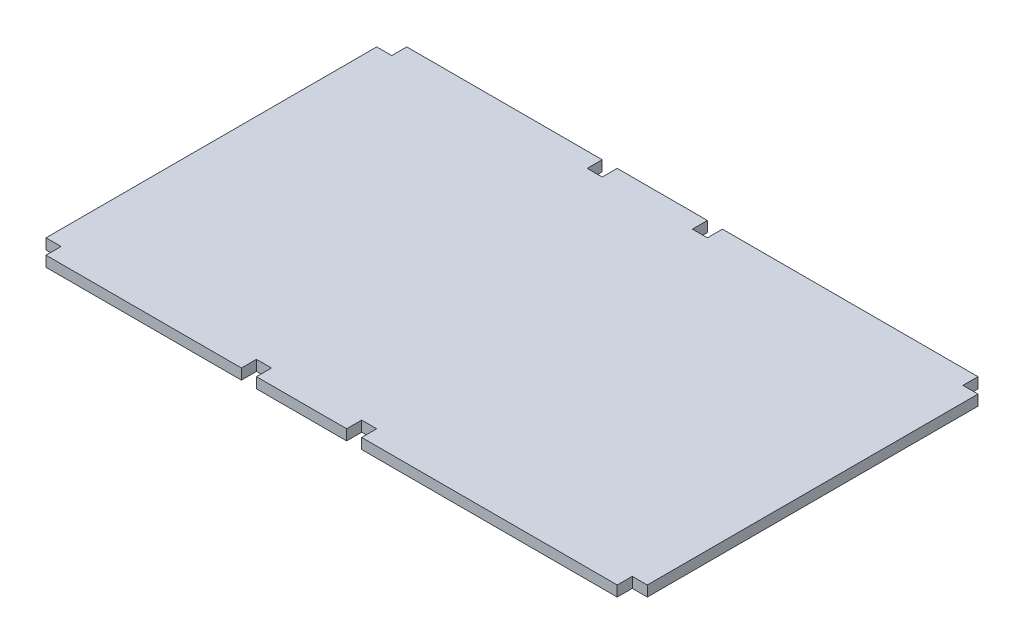
ISO-10303-21;
HEADER;
FILE_DESCRIPTION(('STEP AP214'),'2;1');
FILE_NAME('part.step','',(''),(''),'','','');
FILE_SCHEMA(('AUTOMOTIVE_DESIGN { 1 0 10303 214 1 1 1 1 }'));
ENDSEC;
DATA;
#1=APPLICATION_CONTEXT('core data for automotive mechanical design processes');
#2=APPLICATION_PROTOCOL_DEFINITION('international standard','automotive_design',2000,#1);
#3=PRODUCT_CONTEXT('',#1,'mechanical');
#4=PRODUCT('Part','Part','',(#3));
#5=PRODUCT_RELATED_PRODUCT_CATEGORY('part','',(#4));
#6=PRODUCT_DEFINITION_FORMATION('','',#4);
#7=PRODUCT_DEFINITION_CONTEXT('part definition',#1,'design');
#8=PRODUCT_DEFINITION('design','',#6,#7);
#9=PRODUCT_DEFINITION_SHAPE('','',#8);
#10=(LENGTH_UNIT() NAMED_UNIT(*) SI_UNIT(.MILLI.,.METRE.));
#11=(NAMED_UNIT(*) PLANE_ANGLE_UNIT() SI_UNIT($,.RADIAN.));
#12=(NAMED_UNIT(*) SI_UNIT($,.STERADIAN.) SOLID_ANGLE_UNIT());
#13=UNCERTAINTY_MEASURE_WITH_UNIT(LENGTH_MEASURE(1.E-05),#10,'distance_accuracy_value','');
#14=(GEOMETRIC_REPRESENTATION_CONTEXT(3) GLOBAL_UNCERTAINTY_ASSIGNED_CONTEXT((#13)) GLOBAL_UNIT_ASSIGNED_CONTEXT((#10,
#11,#12)) REPRESENTATION_CONTEXT('',''));
#15=CARTESIAN_POINT('',(0.,0.,0.));
#16=DIRECTION('',(0.,0.,1.));
#17=DIRECTION('',(1.,0.,0.));
#18=AXIS2_PLACEMENT_3D('',#15,#16,#17);
#19=CARTESIAN_POINT('',(-660.4,17.78,-584.2));
#20=DIRECTION('',(-1.,0.,0.));
#21=DIRECTION('',(0.,0.,1.));
#22=AXIS2_PLACEMENT_3D('',#19,#20,#21);
#23=PLANE('',#22);
#24=DIRECTION('',(0.,0.,-1.));
#25=VECTOR('',#24,1.);
#26=CARTESIAN_POINT('',(-660.4,0.,-584.2));
#27=LINE('',#26,#25);
#28=CARTESIAN_POINT('',(-660.4,0.,-584.2));
#29=VERTEX_POINT('',#28);
#30=CARTESIAN_POINT('',(-660.4,0.,-609.6));
#31=VERTEX_POINT('',#30);
#32=EDGE_CURVE('E253',#29,#31,#27,.T.);
#33=ORIENTED_EDGE('',*,*,#32,.T.);
#34=DIRECTION('',(0.,-1.,0.));
#35=VECTOR('',#34,1.);
#36=CARTESIAN_POINT('',(-660.4,17.78,-609.6));
#37=LINE('',#36,#35);
#38=CARTESIAN_POINT('',(-660.4,17.78,-609.6));
#39=VERTEX_POINT('',#38);
#40=EDGE_CURVE('E11',#39,#31,#37,.T.);
#41=ORIENTED_EDGE('',*,*,#40,.F.);
#42=DIRECTION('',(0.,0.,-1.));
#43=VECTOR('',#42,1.);
#44=CARTESIAN_POINT('',(-660.4,17.78,-584.2));
#45=LINE('',#44,#43);
#46=CARTESIAN_POINT('',(-660.4,17.78,-584.2));
#47=VERTEX_POINT('',#46);
#48=EDGE_CURVE('E307',#47,#39,#45,.T.);
#49=ORIENTED_EDGE('',*,*,#48,.F.);
#50=DIRECTION('',(0.,-1.,0.));
#51=VECTOR('',#50,1.);
#52=CARTESIAN_POINT('',(-660.4,17.78,-584.2));
#53=LINE('',#52,#51);
#54=EDGE_CURVE('E249',#47,#29,#53,.T.);
#55=ORIENTED_EDGE('',*,*,#54,.T.);
#56=EDGE_LOOP('',(#33,#41,#49,#55));
#57=FACE_BOUND('',#56,.T.);
#58=ADVANCED_FACE('F37',(#57),#23,.F.);
#59=CARTESIAN_POINT('',(-660.4,17.78,-609.6));
#60=DIRECTION('',(0.,0.,1.));
#61=DIRECTION('',(1.,0.,0.));
#62=AXIS2_PLACEMENT_3D('',#59,#60,#61);
#63=PLANE('',#62);
#64=DIRECTION('',(-1.,0.,0.));
#65=VECTOR('',#64,1.);
#66=CARTESIAN_POINT('',(-660.4,0.,-609.6));
#67=LINE('',#66,#65);
#68=CARTESIAN_POINT('',(-990.6,0.,-609.6));
#69=VERTEX_POINT('',#68);
#70=EDGE_CURVE('E256',#31,#69,#67,.T.);
#71=ORIENTED_EDGE('',*,*,#70,.T.);
#72=DIRECTION('',(0.,-1.,0.));
#73=VECTOR('',#72,1.);
#74=CARTESIAN_POINT('',(-990.6,17.78,-609.6));
#75=LINE('',#74,#73);
#76=CARTESIAN_POINT('',(-990.6,17.78,-609.6));
#77=VERTEX_POINT('',#76);
#78=EDGE_CURVE('E45',#77,#69,#75,.T.);
#79=ORIENTED_EDGE('',*,*,#78,.F.);
#80=DIRECTION('',(-1.,0.,0.));
#81=VECTOR('',#80,1.);
#82=CARTESIAN_POINT('',(-660.4,17.78,-609.6));
#83=LINE('',#82,#81);
#84=EDGE_CURVE('E156',#39,#77,#83,.T.);
#85=ORIENTED_EDGE('',*,*,#84,.F.);
#86=ORIENTED_EDGE('',*,*,#40,.T.);
#87=EDGE_LOOP('',(#71,#79,#85,#86));
#88=FACE_BOUND('',#87,.T.);
#89=ADVANCED_FACE('F465',(#88),#63,.F.);
#90=CARTESIAN_POINT('',(-990.6,17.78,-609.6));
#91=DIRECTION('',(1.,0.,0.));
#92=DIRECTION('',(0.,0.,-1.));
#93=AXIS2_PLACEMENT_3D('',#90,#91,#92);
#94=PLANE('',#93);
#95=DIRECTION('',(0.,0.,1.));
#96=VECTOR('',#95,1.);
#97=CARTESIAN_POINT('',(-990.6,0.,-609.6));
#98=LINE('',#97,#96);
#99=CARTESIAN_POINT('',(-990.6,0.,-584.2));
#100=VERTEX_POINT('',#99);
#101=EDGE_CURVE('E258',#69,#100,#98,.T.);
#102=ORIENTED_EDGE('',*,*,#101,.T.);
#103=DIRECTION('',(0.,-1.,0.));
#104=VECTOR('',#103,1.);
#105=CARTESIAN_POINT('',(-990.6,17.78,-584.2));
#106=LINE('',#105,#104);
#107=CARTESIAN_POINT('',(-990.6,17.78,-584.2));
#108=VERTEX_POINT('',#107);
#109=EDGE_CURVE('E374',#108,#100,#106,.T.);
#110=ORIENTED_EDGE('',*,*,#109,.F.);
#111=DIRECTION('',(0.,0.,1.));
#112=VECTOR('',#111,1.);
#113=CARTESIAN_POINT('',(-990.6,17.78,-609.6));
#114=LINE('',#113,#112);
#115=EDGE_CURVE('E382',#77,#108,#114,.T.);
#116=ORIENTED_EDGE('',*,*,#115,.F.);
#117=ORIENTED_EDGE('',*,*,#78,.T.);
#118=EDGE_LOOP('',(#102,#110,#116,#117));
#119=FACE_BOUND('',#118,.T.);
#120=ADVANCED_FACE('F380',(#119),#94,.F.);
#121=CARTESIAN_POINT('',(-1016.,17.78,-584.2));
#122=DIRECTION('',(0.,0.,1.));
#123=DIRECTION('',(1.,0.,0.));
#124=AXIS2_PLACEMENT_3D('',#121,#122,#123);
#125=PLANE('',#124);
#126=DIRECTION('',(-1.,0.,0.));
#127=VECTOR('',#126,1.);
#128=CARTESIAN_POINT('',(-1016.,0.,-584.2));
#129=LINE('',#128,#127);
#130=CARTESIAN_POINT('',(-1016.,0.,-584.2));
#131=VERTEX_POINT('',#130);
#132=EDGE_CURVE('E260',#100,#131,#129,.T.);
#133=ORIENTED_EDGE('',*,*,#132,.T.);
#134=DIRECTION('',(0.,-1.,0.));
#135=VECTOR('',#134,1.);
#136=CARTESIAN_POINT('',(-1016.,17.78,-584.2));
#137=LINE('',#136,#135);
#138=CARTESIAN_POINT('',(-1016.,17.78,-584.2));
#139=VERTEX_POINT('',#138);
#140=EDGE_CURVE('E371',#139,#131,#137,.T.);
#141=ORIENTED_EDGE('',*,*,#140,.F.);
#142=DIRECTION('',(-1.,0.,0.));
#143=VECTOR('',#142,1.);
#144=CARTESIAN_POINT('',(-1016.,17.78,-584.2));
#145=LINE('',#144,#143);
#146=EDGE_CURVE('E400',#108,#139,#145,.T.);
#147=ORIENTED_EDGE('',*,*,#146,.F.);
#148=ORIENTED_EDGE('',*,*,#109,.T.);
#149=EDGE_LOOP('',(#133,#141,#147,#148));
#150=FACE_BOUND('',#149,.T.);
#151=ADVANCED_FACE('F391',(#150),#125,.F.);
#152=CARTESIAN_POINT('',(-1016.,17.78,-25.3999999999999));
#153=DIRECTION('',(1.,0.,0.));
#154=DIRECTION('',(0.,0.,-1.));
#155=AXIS2_PLACEMENT_3D('',#152,#153,#154);
#156=PLANE('',#155);
#157=DIRECTION('',(0.,0.,1.));
#158=VECTOR('',#157,1.);
#159=CARTESIAN_POINT('',(-1016.,0.,-25.3999999999999));
#160=LINE('',#159,#158);
#161=CARTESIAN_POINT('',(-1016.,0.,-25.3999999999999));
#162=VERTEX_POINT('',#161);
#163=EDGE_CURVE('E262',#131,#162,#160,.T.);
#164=ORIENTED_EDGE('',*,*,#163,.T.);
#165=DIRECTION('',(0.,-1.,0.));
#166=VECTOR('',#165,1.);
#167=CARTESIAN_POINT('',(-1016.,17.78,-25.3999999999999));
#168=LINE('',#167,#166);
#169=CARTESIAN_POINT('',(-1016.,17.78,-25.3999999999999));
#170=VERTEX_POINT('',#169);
#171=EDGE_CURVE('E368',#170,#162,#168,.T.);
#172=ORIENTED_EDGE('',*,*,#171,.F.);
#173=DIRECTION('',(0.,0.,1.));
#174=VECTOR('',#173,1.);
#175=CARTESIAN_POINT('',(-1016.,17.78,-25.3999999999999));
#176=LINE('',#175,#174);
#177=EDGE_CURVE('E397',#139,#170,#176,.T.);
#178=ORIENTED_EDGE('',*,*,#177,.F.);
#179=ORIENTED_EDGE('',*,*,#140,.T.);
#180=EDGE_LOOP('',(#164,#172,#178,#179));
#181=FACE_BOUND('',#180,.T.);
#182=ADVANCED_FACE('F395',(#181),#156,.F.);
#183=CARTESIAN_POINT('',(-1016.,17.78,-25.3999999999999));
#184=DIRECTION('',(0.,0.,-1.));
#185=DIRECTION('',(-1.,0.,0.));
#186=AXIS2_PLACEMENT_3D('',#183,#184,#185);
#187=PLANE('',#186);
#188=DIRECTION('',(1.,0.,0.));
#189=VECTOR('',#188,1.);
#190=CARTESIAN_POINT('',(-1016.,0.,-25.3999999999999));
#191=LINE('',#190,#189);
#192=CARTESIAN_POINT('',(-990.6,0.,-25.3999999999999));
#193=VERTEX_POINT('',#192);
#194=EDGE_CURVE('E264',#162,#193,#191,.T.);
#195=ORIENTED_EDGE('',*,*,#194,.T.);
#196=DIRECTION('',(0.,-1.,0.));
#197=VECTOR('',#196,1.);
#198=CARTESIAN_POINT('',(-990.6,17.78,-25.3999999999999));
#199=LINE('',#198,#197);
#200=CARTESIAN_POINT('',(-990.6,17.78,-25.3999999999999));
#201=VERTEX_POINT('',#200);
#202=EDGE_CURVE('E365',#201,#193,#199,.T.);
#203=ORIENTED_EDGE('',*,*,#202,.F.);
#204=DIRECTION('',(1.,0.,0.));
#205=VECTOR('',#204,1.);
#206=CARTESIAN_POINT('',(-1016.,17.78,-25.3999999999999));
#207=LINE('',#206,#205);
#208=EDGE_CURVE('E399',#170,#201,#207,.T.);
#209=ORIENTED_EDGE('',*,*,#208,.F.);
#210=ORIENTED_EDGE('',*,*,#171,.T.);
#211=EDGE_LOOP('',(#195,#203,#209,#210));
#212=FACE_BOUND('',#211,.T.);
#213=ADVANCED_FACE('F478',(#212),#187,.F.);
#214=CARTESIAN_POINT('',(-990.6,17.78,1.24424114793371E-13));
#215=DIRECTION('',(1.,0.,0.));
#216=DIRECTION('',(0.,0.,-1.));
#217=AXIS2_PLACEMENT_3D('',#214,#215,#216);
#218=PLANE('',#217);
#219=DIRECTION('',(0.,0.,1.));
#220=VECTOR('',#219,1.);
#221=CARTESIAN_POINT('',(-990.6,0.,1.24424114793371E-13));
#222=LINE('',#221,#220);
#223=CARTESIAN_POINT('',(-990.6,0.,1.24424114793371E-13));
#224=VERTEX_POINT('',#223);
#225=EDGE_CURVE('E266',#193,#224,#222,.T.);
#226=ORIENTED_EDGE('',*,*,#225,.T.);
#227=DIRECTION('',(0.,-1.,0.));
#228=VECTOR('',#227,1.);
#229=CARTESIAN_POINT('',(-990.6,17.78,1.24424114793371E-13));
#230=LINE('',#229,#228);
#231=CARTESIAN_POINT('',(-990.6,17.78,1.24424114793371E-13));
#232=VERTEX_POINT('',#231);
#233=EDGE_CURVE('E362',#232,#224,#230,.T.);
#234=ORIENTED_EDGE('',*,*,#233,.F.);
#235=DIRECTION('',(0.,0.,1.));
#236=VECTOR('',#235,1.);
#237=CARTESIAN_POINT('',(-990.6,17.78,1.24424114793371E-13));
#238=LINE('',#237,#236);
#239=EDGE_CURVE('E402',#201,#232,#238,.T.);
#240=ORIENTED_EDGE('',*,*,#239,.F.);
#241=ORIENTED_EDGE('',*,*,#202,.T.);
#242=EDGE_LOOP('',(#226,#234,#240,#241));
#243=FACE_BOUND('',#242,.T.);
#244=ADVANCED_FACE('F481',(#243),#218,.F.);
#245=CARTESIAN_POINT('',(-660.4,17.78,0.));
#246=DIRECTION('',(0.,0.,-1.));
#247=DIRECTION('',(-1.,0.,0.));
#248=AXIS2_PLACEMENT_3D('',#245,#246,#247);
#249=PLANE('',#248);
#250=DIRECTION('',(1.,0.,0.));
#251=VECTOR('',#250,1.);
#252=CARTESIAN_POINT('',(-660.4,0.,0.));
#253=LINE('',#252,#251);
#254=CARTESIAN_POINT('',(-660.4,0.,0.));
#255=VERTEX_POINT('',#254);
#256=EDGE_CURVE('E268',#224,#255,#253,.T.);
#257=ORIENTED_EDGE('',*,*,#256,.T.);
#258=DIRECTION('',(0.,-1.,0.));
#259=VECTOR('',#258,1.);
#260=CARTESIAN_POINT('',(-660.4,17.78,0.));
#261=LINE('',#260,#259);
#262=CARTESIAN_POINT('',(-660.4,17.78,0.));
#263=VERTEX_POINT('',#262);
#264=EDGE_CURVE('E359',#263,#255,#261,.T.);
#265=ORIENTED_EDGE('',*,*,#264,.F.);
#266=DIRECTION('',(1.,0.,0.));
#267=VECTOR('',#266,1.);
#268=CARTESIAN_POINT('',(-660.4,17.78,0.));
#269=LINE('',#268,#267);
#270=EDGE_CURVE('E408',#232,#263,#269,.T.);
#271=ORIENTED_EDGE('',*,*,#270,.F.);
#272=ORIENTED_EDGE('',*,*,#233,.T.);
#273=EDGE_LOOP('',(#257,#265,#271,#272));
#274=FACE_BOUND('',#273,.T.);
#275=ADVANCED_FACE('F485',(#274),#249,.F.);
#276=CARTESIAN_POINT('',(-660.4,17.78,0.));
#277=DIRECTION('',(-1.,0.,0.));
#278=DIRECTION('',(0.,0.,1.));
#279=AXIS2_PLACEMENT_3D('',#276,#277,#278);
#280=PLANE('',#279);
#281=DIRECTION('',(0.,0.,-1.));
#282=VECTOR('',#281,1.);
#283=CARTESIAN_POINT('',(-660.4,0.,0.));
#284=LINE('',#283,#282);
#285=CARTESIAN_POINT('',(-660.4,0.,-25.4));
#286=VERTEX_POINT('',#285);
#287=EDGE_CURVE('E270',#255,#286,#284,.T.);
#288=ORIENTED_EDGE('',*,*,#287,.T.);
#289=DIRECTION('',(0.,-1.,0.));
#290=VECTOR('',#289,1.);
#291=CARTESIAN_POINT('',(-660.4,17.78,-25.4));
#292=LINE('',#291,#290);
#293=CARTESIAN_POINT('',(-660.4,17.78,-25.4));
#294=VERTEX_POINT('',#293);
#295=EDGE_CURVE('E356',#294,#286,#292,.T.);
#296=ORIENTED_EDGE('',*,*,#295,.F.);
#297=DIRECTION('',(0.,0.,-1.));
#298=VECTOR('',#297,1.);
#299=CARTESIAN_POINT('',(-660.4,17.78,0.));
#300=LINE('',#299,#298);
#301=EDGE_CURVE('E410',#263,#294,#300,.T.);
#302=ORIENTED_EDGE('',*,*,#301,.F.);
#303=ORIENTED_EDGE('',*,*,#264,.T.);
#304=EDGE_LOOP('',(#288,#296,#302,#303));
#305=FACE_BOUND('',#304,.T.);
#306=ADVANCED_FACE('F489',(#305),#280,.F.);
#307=CARTESIAN_POINT('',(-635.,17.78,-25.4));
#308=DIRECTION('',(0.,0.,-1.));
#309=DIRECTION('',(-1.,0.,0.));
#310=AXIS2_PLACEMENT_3D('',#307,#308,#309);
#311=PLANE('',#310);
#312=DIRECTION('',(1.,0.,0.));
#313=VECTOR('',#312,1.);
#314=CARTESIAN_POINT('',(-635.,0.,-25.4));
#315=LINE('',#314,#313);
#316=CARTESIAN_POINT('',(-635.,0.,-25.4));
#317=VERTEX_POINT('',#316);
#318=EDGE_CURVE('E272',#286,#317,#315,.T.);
#319=ORIENTED_EDGE('',*,*,#318,.T.);
#320=DIRECTION('',(0.,-1.,0.));
#321=VECTOR('',#320,1.);
#322=CARTESIAN_POINT('',(-635.,17.78,-25.4));
#323=LINE('',#322,#321);
#324=CARTESIAN_POINT('',(-635.,17.78,-25.4));
#325=VERTEX_POINT('',#324);
#326=EDGE_CURVE('E353',#325,#317,#323,.T.);
#327=ORIENTED_EDGE('',*,*,#326,.F.);
#328=DIRECTION('',(1.,0.,0.));
#329=VECTOR('',#328,1.);
#330=CARTESIAN_POINT('',(-635.,17.78,-25.4));
#331=LINE('',#330,#329);
#332=EDGE_CURVE('E412',#294,#325,#331,.T.);
#333=ORIENTED_EDGE('',*,*,#332,.F.);
#334=ORIENTED_EDGE('',*,*,#295,.T.);
#335=EDGE_LOOP('',(#319,#327,#333,#334));
#336=FACE_BOUND('',#335,.T.);
#337=ADVANCED_FACE('F493',(#336),#311,.F.);
#338=CARTESIAN_POINT('',(-635.,17.78,0.));
#339=DIRECTION('',(1.,0.,0.));
#340=DIRECTION('',(0.,0.,-1.));
#341=AXIS2_PLACEMENT_3D('',#338,#339,#340);
#342=PLANE('',#341);
#343=DIRECTION('',(0.,0.,1.));
#344=VECTOR('',#343,1.);
#345=CARTESIAN_POINT('',(-635.,0.,0.));
#346=LINE('',#345,#344);
#347=CARTESIAN_POINT('',(-635.,0.,0.));
#348=VERTEX_POINT('',#347);
#349=EDGE_CURVE('E274',#317,#348,#346,.T.);
#350=ORIENTED_EDGE('',*,*,#349,.T.);
#351=DIRECTION('',(0.,-1.,0.));
#352=VECTOR('',#351,1.);
#353=CARTESIAN_POINT('',(-635.,17.78,0.));
#354=LINE('',#353,#352);
#355=CARTESIAN_POINT('',(-635.,17.78,0.));
#356=VERTEX_POINT('',#355);
#357=EDGE_CURVE('E350',#356,#348,#354,.T.);
#358=ORIENTED_EDGE('',*,*,#357,.F.);
#359=DIRECTION('',(0.,0.,1.));
#360=VECTOR('',#359,1.);
#361=CARTESIAN_POINT('',(-635.,17.78,0.));
#362=LINE('',#361,#360);
#363=EDGE_CURVE('E414',#325,#356,#362,.T.);
#364=ORIENTED_EDGE('',*,*,#363,.F.);
#365=ORIENTED_EDGE('',*,*,#326,.T.);
#366=EDGE_LOOP('',(#350,#358,#364,#365));
#367=FACE_BOUND('',#366,.T.);
#368=ADVANCED_FACE('F497',(#367),#342,.F.);
#369=CARTESIAN_POINT('',(-482.58402657356,17.78,0.));
#370=DIRECTION('',(0.,0.,-1.));
#371=DIRECTION('',(-1.,0.,0.));
#372=AXIS2_PLACEMENT_3D('',#369,#370,#371);
#373=PLANE('',#372);
#374=DIRECTION('',(1.,0.,0.));
#375=VECTOR('',#374,1.);
#376=CARTESIAN_POINT('',(-482.58402657356,0.,0.));
#377=LINE('',#376,#375);
#378=CARTESIAN_POINT('',(-482.58402657356,0.,0.));
#379=VERTEX_POINT('',#378);
#380=EDGE_CURVE('E276',#348,#379,#377,.T.);
#381=ORIENTED_EDGE('',*,*,#380,.T.);
#382=DIRECTION('',(0.,-1.,0.));
#383=VECTOR('',#382,1.);
#384=CARTESIAN_POINT('',(-482.58402657356,17.78,0.));
#385=LINE('',#384,#383);
#386=CARTESIAN_POINT('',(-482.58402657356,17.78,0.));
#387=VERTEX_POINT('',#386);
#388=EDGE_CURVE('E347',#387,#379,#385,.T.);
#389=ORIENTED_EDGE('',*,*,#388,.F.);
#390=DIRECTION('',(1.,0.,0.));
#391=VECTOR('',#390,1.);
#392=CARTESIAN_POINT('',(-482.58402657356,17.78,0.));
#393=LINE('',#392,#391);
#394=EDGE_CURVE('E416',#356,#387,#393,.T.);
#395=ORIENTED_EDGE('',*,*,#394,.F.);
#396=ORIENTED_EDGE('',*,*,#357,.T.);
#397=EDGE_LOOP('',(#381,#389,#395,#396));
#398=FACE_BOUND('',#397,.T.);
#399=ADVANCED_FACE('F501',(#398),#373,.F.);
#400=CARTESIAN_POINT('',(-482.58402657356,17.78,0.));
#401=DIRECTION('',(-1.,0.,0.));
#402=DIRECTION('',(0.,0.,1.));
#403=AXIS2_PLACEMENT_3D('',#400,#401,#402);
#404=PLANE('',#403);
#405=DIRECTION('',(0.,0.,-1.));
#406=VECTOR('',#405,1.);
#407=CARTESIAN_POINT('',(-482.58402657356,0.,0.));
#408=LINE('',#407,#406);
#409=CARTESIAN_POINT('',(-482.58402657356,0.,-25.4));
#410=VERTEX_POINT('',#409);
#411=EDGE_CURVE('E278',#379,#410,#408,.T.);
#412=ORIENTED_EDGE('',*,*,#411,.T.);
#413=DIRECTION('',(0.,-1.,0.));
#414=VECTOR('',#413,1.);
#415=CARTESIAN_POINT('',(-482.58402657356,17.78,-25.4));
#416=LINE('',#415,#414);
#417=CARTESIAN_POINT('',(-482.58402657356,17.78,-25.4));
#418=VERTEX_POINT('',#417);
#419=EDGE_CURVE('E344',#418,#410,#416,.T.);
#420=ORIENTED_EDGE('',*,*,#419,.F.);
#421=DIRECTION('',(0.,0.,-1.));
#422=VECTOR('',#421,1.);
#423=CARTESIAN_POINT('',(-482.58402657356,17.78,0.));
#424=LINE('',#423,#422);
#425=EDGE_CURVE('E418',#387,#418,#424,.T.);
#426=ORIENTED_EDGE('',*,*,#425,.F.);
#427=ORIENTED_EDGE('',*,*,#388,.T.);
#428=EDGE_LOOP('',(#412,#420,#426,#427));
#429=FACE_BOUND('',#428,.T.);
#430=ADVANCED_FACE('F505',(#429),#404,.F.);
#431=CARTESIAN_POINT('',(-457.18402657356,17.78,-25.4));
#432=DIRECTION('',(0.,0.,-1.));
#433=DIRECTION('',(-1.,0.,0.));
#434=AXIS2_PLACEMENT_3D('',#431,#432,#433);
#435=PLANE('',#434);
#436=DIRECTION('',(1.,0.,0.));
#437=VECTOR('',#436,1.);
#438=CARTESIAN_POINT('',(-457.18402657356,0.,-25.4));
#439=LINE('',#438,#437);
#440=CARTESIAN_POINT('',(-457.18402657356,0.,-25.4));
#441=VERTEX_POINT('',#440);
#442=EDGE_CURVE('E280',#410,#441,#439,.T.);
#443=ORIENTED_EDGE('',*,*,#442,.T.);
#444=DIRECTION('',(0.,-1.,0.));
#445=VECTOR('',#444,1.);
#446=CARTESIAN_POINT('',(-457.18402657356,17.78,-25.4));
#447=LINE('',#446,#445);
#448=CARTESIAN_POINT('',(-457.18402657356,17.78,-25.4));
#449=VERTEX_POINT('',#448);
#450=EDGE_CURVE('E341',#449,#441,#447,.T.);
#451=ORIENTED_EDGE('',*,*,#450,.F.);
#452=DIRECTION('',(1.,0.,0.));
#453=VECTOR('',#452,1.);
#454=CARTESIAN_POINT('',(-457.18402657356,17.78,-25.4));
#455=LINE('',#454,#453);
#456=EDGE_CURVE('E420',#418,#449,#455,.T.);
#457=ORIENTED_EDGE('',*,*,#456,.F.);
#458=ORIENTED_EDGE('',*,*,#419,.T.);
#459=EDGE_LOOP('',(#443,#451,#457,#458));
#460=FACE_BOUND('',#459,.T.);
#461=ADVANCED_FACE('F509',(#460),#435,.F.);
#462=CARTESIAN_POINT('',(-457.18402657356,17.78,0.));
#463=DIRECTION('',(1.,0.,0.));
#464=DIRECTION('',(0.,0.,-1.));
#465=AXIS2_PLACEMENT_3D('',#462,#463,#464);
#466=PLANE('',#465);
#467=DIRECTION('',(0.,0.,1.));
#468=VECTOR('',#467,1.);
#469=CARTESIAN_POINT('',(-457.18402657356,0.,0.));
#470=LINE('',#469,#468);
#471=CARTESIAN_POINT('',(-457.18402657356,0.,0.));
#472=VERTEX_POINT('',#471);
#473=EDGE_CURVE('E282',#441,#472,#470,.T.);
#474=ORIENTED_EDGE('',*,*,#473,.T.);
#475=DIRECTION('',(0.,-1.,0.));
#476=VECTOR('',#475,1.);
#477=CARTESIAN_POINT('',(-457.18402657356,17.78,0.));
#478=LINE('',#477,#476);
#479=CARTESIAN_POINT('',(-457.18402657356,17.78,0.));
#480=VERTEX_POINT('',#479);
#481=EDGE_CURVE('E338',#480,#472,#478,.T.);
#482=ORIENTED_EDGE('',*,*,#481,.F.);
#483=DIRECTION('',(0.,0.,1.));
#484=VECTOR('',#483,1.);
#485=CARTESIAN_POINT('',(-457.18402657356,17.78,0.));
#486=LINE('',#485,#484);
#487=EDGE_CURVE('E422',#449,#480,#486,.T.);
#488=ORIENTED_EDGE('',*,*,#487,.F.);
#489=ORIENTED_EDGE('',*,*,#450,.T.);
#490=EDGE_LOOP('',(#474,#482,#488,#489));
#491=FACE_BOUND('',#490,.T.);
#492=ADVANCED_FACE('F513',(#491),#466,.F.);
#493=CARTESIAN_POINT('',(-25.4,17.78,0.));
#494=DIRECTION('',(0.,0.,-1.));
#495=DIRECTION('',(-1.,0.,0.));
#496=AXIS2_PLACEMENT_3D('',#493,#494,#495);
#497=PLANE('',#496);
#498=DIRECTION('',(1.,0.,0.));
#499=VECTOR('',#498,1.);
#500=CARTESIAN_POINT('',(-25.4,0.,0.));
#501=LINE('',#500,#499);
#502=CARTESIAN_POINT('',(-25.4,0.,0.));
#503=VERTEX_POINT('',#502);
#504=EDGE_CURVE('E284',#472,#503,#501,.T.);
#505=ORIENTED_EDGE('',*,*,#504,.T.);
#506=DIRECTION('',(0.,-1.,0.));
#507=VECTOR('',#506,1.);
#508=CARTESIAN_POINT('',(-25.4,17.78,0.));
#509=LINE('',#508,#507);
#510=CARTESIAN_POINT('',(-25.4,17.78,0.));
#511=VERTEX_POINT('',#510);
#512=EDGE_CURVE('E335',#511,#503,#509,.T.);
#513=ORIENTED_EDGE('',*,*,#512,.F.);
#514=DIRECTION('',(1.,0.,0.));
#515=VECTOR('',#514,1.);
#516=CARTESIAN_POINT('',(-25.4,17.78,0.));
#517=LINE('',#516,#515);
#518=EDGE_CURVE('E424',#480,#511,#517,.T.);
#519=ORIENTED_EDGE('',*,*,#518,.F.);
#520=ORIENTED_EDGE('',*,*,#481,.T.);
#521=EDGE_LOOP('',(#505,#513,#519,#520));
#522=FACE_BOUND('',#521,.T.);
#523=ADVANCED_FACE('F517',(#522),#497,.F.);
#524=CARTESIAN_POINT('',(-25.4,17.78,0.));
#525=DIRECTION('',(-1.,0.,0.));
#526=DIRECTION('',(0.,0.,1.));
#527=AXIS2_PLACEMENT_3D('',#524,#525,#526);
#528=PLANE('',#527);
#529=DIRECTION('',(0.,0.,-1.));
#530=VECTOR('',#529,1.);
#531=CARTESIAN_POINT('',(-25.4,0.,0.));
#532=LINE('',#531,#530);
#533=CARTESIAN_POINT('',(-25.4,0.,-25.4));
#534=VERTEX_POINT('',#533);
#535=EDGE_CURVE('E286',#503,#534,#532,.T.);
#536=ORIENTED_EDGE('',*,*,#535,.T.);
#537=DIRECTION('',(0.,-1.,0.));
#538=VECTOR('',#537,1.);
#539=CARTESIAN_POINT('',(-25.4,17.78,-25.4));
#540=LINE('',#539,#538);
#541=CARTESIAN_POINT('',(-25.4,17.78,-25.4));
#542=VERTEX_POINT('',#541);
#543=EDGE_CURVE('E332',#542,#534,#540,.T.);
#544=ORIENTED_EDGE('',*,*,#543,.F.);
#545=DIRECTION('',(0.,0.,-1.));
#546=VECTOR('',#545,1.);
#547=CARTESIAN_POINT('',(-25.4,17.78,0.));
#548=LINE('',#547,#546);
#549=EDGE_CURVE('E426',#511,#542,#548,.T.);
#550=ORIENTED_EDGE('',*,*,#549,.F.);
#551=ORIENTED_EDGE('',*,*,#512,.T.);
#552=EDGE_LOOP('',(#536,#544,#550,#551));
#553=FACE_BOUND('',#552,.T.);
#554=ADVANCED_FACE('F521',(#553),#528,.F.);
#555=CARTESIAN_POINT('',(0.,17.78,-25.4));
#556=DIRECTION('',(0.,0.,-1.));
#557=DIRECTION('',(-1.,0.,0.));
#558=AXIS2_PLACEMENT_3D('',#555,#556,#557);
#559=PLANE('',#558);
#560=DIRECTION('',(1.,0.,0.));
#561=VECTOR('',#560,1.);
#562=CARTESIAN_POINT('',(0.,0.,-25.4));
#563=LINE('',#562,#561);
#564=CARTESIAN_POINT('',(0.,0.,-25.4));
#565=VERTEX_POINT('',#564);
#566=EDGE_CURVE('E288',#534,#565,#563,.T.);
#567=ORIENTED_EDGE('',*,*,#566,.T.);
#568=DIRECTION('',(0.,-1.,0.));
#569=VECTOR('',#568,1.);
#570=CARTESIAN_POINT('',(0.,17.78,-25.4));
#571=LINE('',#570,#569);
#572=CARTESIAN_POINT('',(0.,17.78,-25.4));
#573=VERTEX_POINT('',#572);
#574=EDGE_CURVE('E329',#573,#565,#571,.T.);
#575=ORIENTED_EDGE('',*,*,#574,.F.);
#576=DIRECTION('',(1.,0.,0.));
#577=VECTOR('',#576,1.);
#578=CARTESIAN_POINT('',(0.,17.78,-25.4));
#579=LINE('',#578,#577);
#580=EDGE_CURVE('E428',#542,#573,#579,.T.);
#581=ORIENTED_EDGE('',*,*,#580,.F.);
#582=ORIENTED_EDGE('',*,*,#543,.T.);
#583=EDGE_LOOP('',(#567,#575,#581,#582));
#584=FACE_BOUND('',#583,.T.);
#585=ADVANCED_FACE('F525',(#584),#559,.F.);
#586=CARTESIAN_POINT('',(0.,17.78,-25.4));
#587=DIRECTION('',(-1.,0.,0.));
#588=DIRECTION('',(0.,0.,1.));
#589=AXIS2_PLACEMENT_3D('',#586,#587,#588);
#590=PLANE('',#589);
#591=DIRECTION('',(0.,0.,-1.));
#592=VECTOR('',#591,1.);
#593=CARTESIAN_POINT('',(0.,0.,-25.4));
#594=LINE('',#593,#592);
#595=CARTESIAN_POINT('',(0.,0.,-584.2));
#596=VERTEX_POINT('',#595);
#597=EDGE_CURVE('E290',#565,#596,#594,.T.);
#598=ORIENTED_EDGE('',*,*,#597,.T.);
#599=DIRECTION('',(0.,-1.,0.));
#600=VECTOR('',#599,1.);
#601=CARTESIAN_POINT('',(0.,17.78,-584.2));
#602=LINE('',#601,#600);
#603=CARTESIAN_POINT('',(0.,17.78,-584.2));
#604=VERTEX_POINT('',#603);
#605=EDGE_CURVE('E326',#604,#596,#602,.T.);
#606=ORIENTED_EDGE('',*,*,#605,.F.);
#607=DIRECTION('',(0.,0.,-1.));
#608=VECTOR('',#607,1.);
#609=CARTESIAN_POINT('',(0.,17.78,-25.4));
#610=LINE('',#609,#608);
#611=EDGE_CURVE('E430',#573,#604,#610,.T.);
#612=ORIENTED_EDGE('',*,*,#611,.F.);
#613=ORIENTED_EDGE('',*,*,#574,.T.);
#614=EDGE_LOOP('',(#598,#606,#612,#613));
#615=FACE_BOUND('',#614,.T.);
#616=ADVANCED_FACE('F529',(#615),#590,.F.);
#617=CARTESIAN_POINT('',(0.,17.78,-584.2));
#618=DIRECTION('',(0.,0.,1.));
#619=DIRECTION('',(1.,0.,0.));
#620=AXIS2_PLACEMENT_3D('',#617,#618,#619);
#621=PLANE('',#620);
#622=DIRECTION('',(-1.,0.,0.));
#623=VECTOR('',#622,1.);
#624=CARTESIAN_POINT('',(0.,0.,-584.2));
#625=LINE('',#624,#623);
#626=CARTESIAN_POINT('',(-25.4,0.,-584.2));
#627=VERTEX_POINT('',#626);
#628=EDGE_CURVE('E292',#596,#627,#625,.T.);
#629=ORIENTED_EDGE('',*,*,#628,.T.);
#630=DIRECTION('',(0.,-1.,0.));
#631=VECTOR('',#630,1.);
#632=CARTESIAN_POINT('',(-25.4,17.78,-584.2));
#633=LINE('',#632,#631);
#634=CARTESIAN_POINT('',(-25.4,17.78,-584.2));
#635=VERTEX_POINT('',#634);
#636=EDGE_CURVE('E323',#635,#627,#633,.T.);
#637=ORIENTED_EDGE('',*,*,#636,.F.);
#638=DIRECTION('',(-1.,0.,0.));
#639=VECTOR('',#638,1.);
#640=CARTESIAN_POINT('',(0.,17.78,-584.2));
#641=LINE('',#640,#639);
#642=EDGE_CURVE('E432',#604,#635,#641,.T.);
#643=ORIENTED_EDGE('',*,*,#642,.F.);
#644=ORIENTED_EDGE('',*,*,#605,.T.);
#645=EDGE_LOOP('',(#629,#637,#643,#644));
#646=FACE_BOUND('',#645,.T.);
#647=ADVANCED_FACE('F533',(#646),#621,.F.);
#648=CARTESIAN_POINT('',(-25.4,17.78,-609.6));
#649=DIRECTION('',(-1.,0.,0.));
#650=DIRECTION('',(0.,0.,1.));
#651=AXIS2_PLACEMENT_3D('',#648,#649,#650);
#652=PLANE('',#651);
#653=DIRECTION('',(0.,0.,-1.));
#654=VECTOR('',#653,1.);
#655=CARTESIAN_POINT('',(-25.4,0.,-609.6));
#656=LINE('',#655,#654);
#657=CARTESIAN_POINT('',(-25.4,0.,-609.6));
#658=VERTEX_POINT('',#657);
#659=EDGE_CURVE('E294',#627,#658,#656,.T.);
#660=ORIENTED_EDGE('',*,*,#659,.T.);
#661=DIRECTION('',(0.,-1.,0.));
#662=VECTOR('',#661,1.);
#663=CARTESIAN_POINT('',(-25.4,17.78,-609.6));
#664=LINE('',#663,#662);
#665=CARTESIAN_POINT('',(-25.4,17.78,-609.6));
#666=VERTEX_POINT('',#665);
#667=EDGE_CURVE('E320',#666,#658,#664,.T.);
#668=ORIENTED_EDGE('',*,*,#667,.F.);
#669=DIRECTION('',(0.,0.,-1.));
#670=VECTOR('',#669,1.);
#671=CARTESIAN_POINT('',(-25.4,17.78,-609.6));
#672=LINE('',#671,#670);
#673=EDGE_CURVE('E434',#635,#666,#672,.T.);
#674=ORIENTED_EDGE('',*,*,#673,.F.);
#675=ORIENTED_EDGE('',*,*,#636,.T.);
#676=EDGE_LOOP('',(#660,#668,#674,#675));
#677=FACE_BOUND('',#676,.T.);
#678=ADVANCED_FACE('F537',(#677),#652,.F.);
#679=CARTESIAN_POINT('',(-25.4,17.78,-609.6));
#680=DIRECTION('',(0.,0.,1.));
#681=DIRECTION('',(1.,0.,0.));
#682=AXIS2_PLACEMENT_3D('',#679,#680,#681);
#683=PLANE('',#682);
#684=DIRECTION('',(-1.,0.,0.));
#685=VECTOR('',#684,1.);
#686=CARTESIAN_POINT('',(-25.4,0.,-609.6));
#687=LINE('',#686,#685);
#688=CARTESIAN_POINT('',(-457.18402657356,0.,-609.6));
#689=VERTEX_POINT('',#688);
#690=EDGE_CURVE('E296',#658,#689,#687,.T.);
#691=ORIENTED_EDGE('',*,*,#690,.T.);
#692=DIRECTION('',(0.,-1.,0.));
#693=VECTOR('',#692,1.);
#694=CARTESIAN_POINT('',(-457.18402657356,17.78,-609.6));
#695=LINE('',#694,#693);
#696=CARTESIAN_POINT('',(-457.18402657356,17.78,-609.6));
#697=VERTEX_POINT('',#696);
#698=EDGE_CURVE('E317',#697,#689,#695,.T.);
#699=ORIENTED_EDGE('',*,*,#698,.F.);
#700=DIRECTION('',(-1.,0.,0.));
#701=VECTOR('',#700,1.);
#702=CARTESIAN_POINT('',(-25.4,17.78,-609.6));
#703=LINE('',#702,#701);
#704=EDGE_CURVE('E436',#666,#697,#703,.T.);
#705=ORIENTED_EDGE('',*,*,#704,.F.);
#706=ORIENTED_EDGE('',*,*,#667,.T.);
#707=EDGE_LOOP('',(#691,#699,#705,#706));
#708=FACE_BOUND('',#707,.T.);
#709=ADVANCED_FACE('F541',(#708),#683,.F.);
#710=CARTESIAN_POINT('',(-457.18402657356,17.78,-584.2));
#711=DIRECTION('',(1.,0.,0.));
#712=DIRECTION('',(0.,0.,-1.));
#713=AXIS2_PLACEMENT_3D('',#710,#711,#712);
#714=PLANE('',#713);
#715=DIRECTION('',(0.,0.,1.));
#716=VECTOR('',#715,1.);
#717=CARTESIAN_POINT('',(-457.18402657356,0.,-584.2));
#718=LINE('',#717,#716);
#719=CARTESIAN_POINT('',(-457.18402657356,0.,-584.2));
#720=VERTEX_POINT('',#719);
#721=EDGE_CURVE('E298',#689,#720,#718,.T.);
#722=ORIENTED_EDGE('',*,*,#721,.T.);
#723=DIRECTION('',(0.,-1.,0.));
#724=VECTOR('',#723,1.);
#725=CARTESIAN_POINT('',(-457.18402657356,17.78,-584.2));
#726=LINE('',#725,#724);
#727=CARTESIAN_POINT('',(-457.18402657356,17.78,-584.2));
#728=VERTEX_POINT('',#727);
#729=EDGE_CURVE('E314',#728,#720,#726,.T.);
#730=ORIENTED_EDGE('',*,*,#729,.F.);
#731=DIRECTION('',(0.,0.,1.));
#732=VECTOR('',#731,1.);
#733=CARTESIAN_POINT('',(-457.18402657356,17.78,-584.2));
#734=LINE('',#733,#732);
#735=EDGE_CURVE('E438',#697,#728,#734,.T.);
#736=ORIENTED_EDGE('',*,*,#735,.F.);
#737=ORIENTED_EDGE('',*,*,#698,.T.);
#738=EDGE_LOOP('',(#722,#730,#736,#737));
#739=FACE_BOUND('',#738,.T.);
#740=ADVANCED_FACE('F545',(#739),#714,.F.);
#741=CARTESIAN_POINT('',(-457.18402657356,17.78,-584.2));
#742=DIRECTION('',(0.,0.,1.));
#743=DIRECTION('',(1.,0.,0.));
#744=AXIS2_PLACEMENT_3D('',#741,#742,#743);
#745=PLANE('',#744);
#746=DIRECTION('',(-1.,0.,0.));
#747=VECTOR('',#746,1.);
#748=CARTESIAN_POINT('',(-457.18402657356,0.,-584.2));
#749=LINE('',#748,#747);
#750=CARTESIAN_POINT('',(-482.58402657356,0.,-584.2));
#751=VERTEX_POINT('',#750);
#752=EDGE_CURVE('E300',#720,#751,#749,.T.);
#753=ORIENTED_EDGE('',*,*,#752,.T.);
#754=DIRECTION('',(0.,-1.,0.));
#755=VECTOR('',#754,1.);
#756=CARTESIAN_POINT('',(-482.58402657356,17.78,-584.2));
#757=LINE('',#756,#755);
#758=CARTESIAN_POINT('',(-482.58402657356,17.78,-584.2));
#759=VERTEX_POINT('',#758);
#760=EDGE_CURVE('E311',#759,#751,#757,.T.);
#761=ORIENTED_EDGE('',*,*,#760,.F.);
#762=DIRECTION('',(-1.,0.,0.));
#763=VECTOR('',#762,1.);
#764=CARTESIAN_POINT('',(-457.18402657356,17.78,-584.2));
#765=LINE('',#764,#763);
#766=EDGE_CURVE('E440',#728,#759,#765,.T.);
#767=ORIENTED_EDGE('',*,*,#766,.F.);
#768=ORIENTED_EDGE('',*,*,#729,.T.);
#769=EDGE_LOOP('',(#753,#761,#767,#768));
#770=FACE_BOUND('',#769,.T.);
#771=ADVANCED_FACE('F446',(#770),#745,.F.);
#772=CARTESIAN_POINT('',(-482.58402657356,17.78,-584.2));
#773=DIRECTION('',(-1.,0.,0.));
#774=DIRECTION('',(0.,0.,1.));
#775=AXIS2_PLACEMENT_3D('',#772,#773,#774);
#776=PLANE('',#775);
#777=DIRECTION('',(0.,0.,-1.));
#778=VECTOR('',#777,1.);
#779=CARTESIAN_POINT('',(-482.58402657356,0.,-584.2));
#780=LINE('',#779,#778);
#781=CARTESIAN_POINT('',(-482.58402657356,0.,-609.6));
#782=VERTEX_POINT('',#781);
#783=EDGE_CURVE('E302',#751,#782,#780,.T.);
#784=ORIENTED_EDGE('',*,*,#783,.T.);
#785=DIRECTION('',(0.,-1.,0.));
#786=VECTOR('',#785,1.);
#787=CARTESIAN_POINT('',(-482.58402657356,17.78,-609.6));
#788=LINE('',#787,#786);
#789=CARTESIAN_POINT('',(-482.58402657356,17.78,-609.6));
#790=VERTEX_POINT('',#789);
#791=EDGE_CURVE('E244',#790,#782,#788,.T.);
#792=ORIENTED_EDGE('',*,*,#791,.F.);
#793=DIRECTION('',(0.,0.,-1.));
#794=VECTOR('',#793,1.);
#795=CARTESIAN_POINT('',(-482.58402657356,17.78,-584.2));
#796=LINE('',#795,#794);
#797=EDGE_CURVE('E235',#759,#790,#796,.T.);
#798=ORIENTED_EDGE('',*,*,#797,.F.);
#799=ORIENTED_EDGE('',*,*,#760,.T.);
#800=EDGE_LOOP('',(#784,#792,#798,#799));
#801=FACE_BOUND('',#800,.T.);
#802=ADVANCED_FACE('F450',(#801),#776,.F.);
#803=CARTESIAN_POINT('',(-482.58402657356,17.78,-609.6));
#804=DIRECTION('',(0.,0.,1.));
#805=DIRECTION('',(1.,0.,0.));
#806=AXIS2_PLACEMENT_3D('',#803,#804,#805);
#807=PLANE('',#806);
#808=DIRECTION('',(-1.,0.,0.));
#809=VECTOR('',#808,1.);
#810=CARTESIAN_POINT('',(-482.58402657356,0.,-609.6));
#811=LINE('',#810,#809);
#812=CARTESIAN_POINT('',(-635.,0.,-609.6));
#813=VERTEX_POINT('',#812);
#814=EDGE_CURVE('E243',#782,#813,#811,.T.);
#815=ORIENTED_EDGE('',*,*,#814,.T.);
#816=DIRECTION('',(0.,-1.,0.));
#817=VECTOR('',#816,1.);
#818=CARTESIAN_POINT('',(-635.,17.78,-609.6));
#819=LINE('',#818,#817);
#820=CARTESIAN_POINT('',(-635.,17.78,-609.6));
#821=VERTEX_POINT('',#820);
#822=EDGE_CURVE('E240',#821,#813,#819,.T.);
#823=ORIENTED_EDGE('',*,*,#822,.F.);
#824=DIRECTION('',(-1.,0.,0.));
#825=VECTOR('',#824,1.);
#826=CARTESIAN_POINT('',(-482.58402657356,17.78,-609.6));
#827=LINE('',#826,#825);
#828=EDGE_CURVE('E229',#790,#821,#827,.T.);
#829=ORIENTED_EDGE('',*,*,#828,.F.);
#830=ORIENTED_EDGE('',*,*,#791,.T.);
#831=EDGE_LOOP('',(#815,#823,#829,#830));
#832=FACE_BOUND('',#831,.T.);
#833=ADVANCED_FACE('F241',(#832),#807,.F.);
#834=CARTESIAN_POINT('',(-635.,17.78,-584.2));
#835=DIRECTION('',(1.,0.,0.));
#836=DIRECTION('',(0.,0.,-1.));
#837=AXIS2_PLACEMENT_3D('',#834,#835,#836);
#838=PLANE('',#837);
#839=DIRECTION('',(0.,0.,1.));
#840=VECTOR('',#839,1.);
#841=CARTESIAN_POINT('',(-635.,0.,-584.2));
#842=LINE('',#841,#840);
#843=CARTESIAN_POINT('',(-635.,0.,-584.2));
#844=VERTEX_POINT('',#843);
#845=EDGE_CURVE('E142',#813,#844,#842,.T.);
#846=ORIENTED_EDGE('',*,*,#845,.T.);
#847=DIRECTION('',(0.,-1.,0.));
#848=VECTOR('',#847,1.);
#849=CARTESIAN_POINT('',(-635.,17.78,-584.2));
#850=LINE('',#849,#848);
#851=CARTESIAN_POINT('',(-635.,17.78,-584.2));
#852=VERTEX_POINT('',#851);
#853=EDGE_CURVE('E245',#852,#844,#850,.T.);
#854=ORIENTED_EDGE('',*,*,#853,.F.);
#855=DIRECTION('',(0.,0.,1.));
#856=VECTOR('',#855,1.);
#857=CARTESIAN_POINT('',(-635.,17.78,-584.2));
#858=LINE('',#857,#856);
#859=EDGE_CURVE('E233',#821,#852,#858,.T.);
#860=ORIENTED_EDGE('',*,*,#859,.F.);
#861=ORIENTED_EDGE('',*,*,#822,.T.);
#862=EDGE_LOOP('',(#846,#854,#860,#861));
#863=FACE_BOUND('',#862,.T.);
#864=ADVANCED_FACE('F247',(#863),#838,.F.);
#865=CARTESIAN_POINT('',(-660.4,17.78,-584.2));
#866=DIRECTION('',(0.,0.,1.));
#867=DIRECTION('',(1.,0.,0.));
#868=AXIS2_PLACEMENT_3D('',#865,#866,#867);
#869=PLANE('',#868);
#870=DIRECTION('',(-1.,0.,0.));
#871=VECTOR('',#870,1.);
#872=CARTESIAN_POINT('',(-660.4,0.,-584.2));
#873=LINE('',#872,#871);
#874=EDGE_CURVE('E148',#844,#29,#873,.T.);
#875=ORIENTED_EDGE('',*,*,#874,.T.);
#876=ORIENTED_EDGE('',*,*,#54,.F.);
#877=DIRECTION('',(-1.,0.,0.));
#878=VECTOR('',#877,1.);
#879=CARTESIAN_POINT('',(-660.4,17.78,-584.2));
#880=LINE('',#879,#878);
#881=EDGE_CURVE('E53',#852,#47,#880,.T.);
#882=ORIENTED_EDGE('',*,*,#881,.F.);
#883=ORIENTED_EDGE('',*,*,#853,.T.);
#884=EDGE_LOOP('',(#875,#876,#882,#883));
#885=FACE_BOUND('',#884,.T.);
#886=ADVANCED_FACE('F454',(#885),#869,.F.);
#887=CARTESIAN_POINT('',(0.,17.78,0.));
#888=DIRECTION('',(0.,1.,0.));
#889=DIRECTION('',(0.,0.,1.));
#890=AXIS2_PLACEMENT_3D('',#887,#888,#889);
#891=PLANE('',#890);
#892=ORIENTED_EDGE('',*,*,#48,.T.);
#893=ORIENTED_EDGE('',*,*,#84,.T.);
#894=ORIENTED_EDGE('',*,*,#115,.T.);
#895=ORIENTED_EDGE('',*,*,#146,.T.);
#896=ORIENTED_EDGE('',*,*,#177,.T.);
#897=ORIENTED_EDGE('',*,*,#208,.T.);
#898=ORIENTED_EDGE('',*,*,#239,.T.);
#899=ORIENTED_EDGE('',*,*,#270,.T.);
#900=ORIENTED_EDGE('',*,*,#301,.T.);
#901=ORIENTED_EDGE('',*,*,#332,.T.);
#902=ORIENTED_EDGE('',*,*,#363,.T.);
#903=ORIENTED_EDGE('',*,*,#394,.T.);
#904=ORIENTED_EDGE('',*,*,#425,.T.);
#905=ORIENTED_EDGE('',*,*,#456,.T.);
#906=ORIENTED_EDGE('',*,*,#487,.T.);
#907=ORIENTED_EDGE('',*,*,#518,.T.);
#908=ORIENTED_EDGE('',*,*,#549,.T.);
#909=ORIENTED_EDGE('',*,*,#580,.T.);
#910=ORIENTED_EDGE('',*,*,#611,.T.);
#911=ORIENTED_EDGE('',*,*,#642,.T.);
#912=ORIENTED_EDGE('',*,*,#673,.T.);
#913=ORIENTED_EDGE('',*,*,#704,.T.);
#914=ORIENTED_EDGE('',*,*,#735,.T.);
#915=ORIENTED_EDGE('',*,*,#766,.T.);
#916=ORIENTED_EDGE('',*,*,#797,.T.);
#917=ORIENTED_EDGE('',*,*,#828,.T.);
#918=ORIENTED_EDGE('',*,*,#859,.T.);
#919=ORIENTED_EDGE('',*,*,#881,.T.);
#920=EDGE_LOOP('',(#892,#893,#894,#895,#896,#897,#898,#899,#900,#901,#902,#903,#904,#905,#906,
#907,#908,#909,#910,#911,#912,#913,#914,#915,#916,#917,#918,#919));
#921=FACE_BOUND('',#920,.T.);
#922=ADVANCED_FACE('F231',(#921),#891,.T.);
#923=CARTESIAN_POINT('',(0.,0.,0.));
#924=DIRECTION('',(0.,1.,0.));
#925=DIRECTION('',(0.,0.,1.));
#926=AXIS2_PLACEMENT_3D('',#923,#924,#925);
#927=PLANE('',#926);
#928=ORIENTED_EDGE('',*,*,#32,.F.);
#929=ORIENTED_EDGE('',*,*,#874,.F.);
#930=ORIENTED_EDGE('',*,*,#845,.F.);
#931=ORIENTED_EDGE('',*,*,#814,.F.);
#932=ORIENTED_EDGE('',*,*,#783,.F.);
#933=ORIENTED_EDGE('',*,*,#752,.F.);
#934=ORIENTED_EDGE('',*,*,#721,.F.);
#935=ORIENTED_EDGE('',*,*,#690,.F.);
#936=ORIENTED_EDGE('',*,*,#659,.F.);
#937=ORIENTED_EDGE('',*,*,#628,.F.);
#938=ORIENTED_EDGE('',*,*,#597,.F.);
#939=ORIENTED_EDGE('',*,*,#566,.F.);
#940=ORIENTED_EDGE('',*,*,#535,.F.);
#941=ORIENTED_EDGE('',*,*,#504,.F.);
#942=ORIENTED_EDGE('',*,*,#473,.F.);
#943=ORIENTED_EDGE('',*,*,#442,.F.);
#944=ORIENTED_EDGE('',*,*,#411,.F.);
#945=ORIENTED_EDGE('',*,*,#380,.F.);
#946=ORIENTED_EDGE('',*,*,#349,.F.);
#947=ORIENTED_EDGE('',*,*,#318,.F.);
#948=ORIENTED_EDGE('',*,*,#287,.F.);
#949=ORIENTED_EDGE('',*,*,#256,.F.);
#950=ORIENTED_EDGE('',*,*,#225,.F.);
#951=ORIENTED_EDGE('',*,*,#194,.F.);
#952=ORIENTED_EDGE('',*,*,#163,.F.);
#953=ORIENTED_EDGE('',*,*,#132,.F.);
#954=ORIENTED_EDGE('',*,*,#101,.F.);
#955=ORIENTED_EDGE('',*,*,#70,.F.);
#956=EDGE_LOOP('',(#928,#929,#930,#931,#932,#933,#934,#935,#936,#937,#938,#939,#940,#941,#942,
#943,#944,#945,#946,#947,#948,#949,#950,#951,#952,#953,#954,#955));
#957=FACE_BOUND('',#956,.T.);
#958=ADVANCED_FACE('F386',(#957),#927,.F.);
#959=CLOSED_SHELL('',(#58,#89,#120,#151,#182,#213,#244,#275,#306,#337,#368,#399,#430,#461,#492,
#523,#554,#585,#616,#647,#678,#709,#740,#771,#802,#833,#864,#886,#922,#958));
#960=MANIFOLD_SOLID_BREP('B2',#959);
#961=ADVANCED_BREP_SHAPE_REPRESENTATION('',(#18,#960),#14);
#962=SHAPE_DEFINITION_REPRESENTATION(#9,#961);
ENDSEC;
END-ISO-10303-21;
